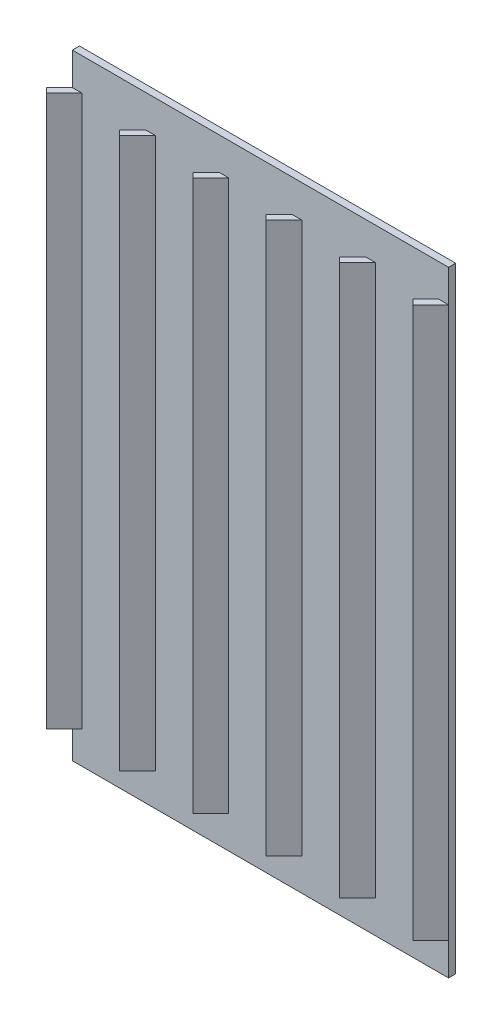
ISO-10303-21;
HEADER;
FILE_DESCRIPTION(('STEP AP214'),'2;1');
FILE_NAME('part.step','',(''),(''),'','','');
FILE_SCHEMA(('AUTOMOTIVE_DESIGN { 1 0 10303 214 1 1 1 1 }'));
ENDSEC;
DATA;
#1=APPLICATION_CONTEXT('core data for automotive mechanical design processes');
#2=APPLICATION_PROTOCOL_DEFINITION('international standard','automotive_design',2000,#1);
#3=PRODUCT_CONTEXT('',#1,'mechanical');
#4=PRODUCT('Part','Part','',(#3));
#5=PRODUCT_RELATED_PRODUCT_CATEGORY('part','',(#4));
#6=PRODUCT_DEFINITION_FORMATION('','',#4);
#7=PRODUCT_DEFINITION_CONTEXT('part definition',#1,'design');
#8=PRODUCT_DEFINITION('design','',#6,#7);
#9=PRODUCT_DEFINITION_SHAPE('','',#8);
#10=(LENGTH_UNIT() NAMED_UNIT(*) SI_UNIT(.MILLI.,.METRE.));
#11=(NAMED_UNIT(*) PLANE_ANGLE_UNIT() SI_UNIT($,.RADIAN.));
#12=(NAMED_UNIT(*) SI_UNIT($,.STERADIAN.) SOLID_ANGLE_UNIT());
#13=UNCERTAINTY_MEASURE_WITH_UNIT(LENGTH_MEASURE(1.E-05),#10,'distance_accuracy_value','');
#14=(GEOMETRIC_REPRESENTATION_CONTEXT(3) GLOBAL_UNCERTAINTY_ASSIGNED_CONTEXT((#13)) GLOBAL_UNIT_ASSIGNED_CONTEXT((#10,
#11,#12)) REPRESENTATION_CONTEXT('',''));
#15=CARTESIAN_POINT('',(0.,0.,0.));
#16=DIRECTION('',(0.,0.,1.));
#17=DIRECTION('',(1.,0.,0.));
#18=AXIS2_PLACEMENT_3D('',#15,#16,#17);
#19=CARTESIAN_POINT('',(-0.600993596973246,-25.4,0.9525));
#20=DIRECTION('',(0.,-1.,0.));
#21=DIRECTION('',(1.,0.,0.));
#22=AXIS2_PLACEMENT_3D('',#19,#20,#21);
#23=PLANE('',#22);
#24=DIRECTION('',(-1.,0.,0.));
#25=VECTOR('',#24,1.);
#26=CARTESIAN_POINT('',(-15.6680023283733,-25.4,0.254));
#27=LINE('',#26,#25);
#28=CARTESIAN_POINT('',(19.05,-25.4,0.254000000000018));
#29=VERTEX_POINT('',#28);
#30=CARTESIAN_POINT('',(18.1519743878931,-25.4,0.254000000000006));
#31=VERTEX_POINT('',#30);
#32=EDGE_CURVE('E58',#29,#31,#27,.T.);
#33=ORIENTED_EDGE('',*,*,#32,.F.);
#34=DIRECTION('',(0.707106781186548,0.,-0.707106781186548));
#35=VECTOR('',#34,1.);
#36=CARTESIAN_POINT('',(18.2245,-25.4,1.07950000000001));
#37=LINE('',#36,#35);
#38=CARTESIAN_POINT('',(17.399,-25.4,1.905));
#39=VERTEX_POINT('',#38);
#40=EDGE_CURVE('E366',#39,#29,#37,.T.);
#41=ORIENTED_EDGE('',*,*,#40,.F.);
#42=DIRECTION('',(-0.707106781186547,0.,-0.707106781186548));
#43=VECTOR('',#42,1.);
#44=CARTESIAN_POINT('',(17.1744935969733,-25.4,1.68049359697327));
#45=LINE('',#44,#43);
#46=CARTESIAN_POINT('',(16.9499871939465,-25.4,1.45598719394653));
#47=VERTEX_POINT('',#46);
#48=EDGE_CURVE('E358',#39,#47,#45,.T.);
#49=ORIENTED_EDGE('',*,*,#48,.T.);
#50=DIRECTION('',(0.707106781186548,0.,-0.707106781186548));
#51=VECTOR('',#50,1.);
#52=CARTESIAN_POINT('',(17.5509807909198,-25.4,0.854993596973271));
#53=LINE('',#52,#51);
#54=EDGE_CURVE('E349',#47,#31,#53,.T.);
#55=ORIENTED_EDGE('',*,*,#54,.T.);
#56=EDGE_LOOP('',(#33,#41,#49,#55));
#57=FACE_BOUND('',#56,.T.);
#58=ADVANCED_FACE('F47',(#57),#23,.T.);
#59=CARTESIAN_POINT('',(12.2860046567467,-25.4,0.254000000000004));
#60=VERTEX_POINT('',#59);
#61=CARTESIAN_POINT('',(11.3879790446398,-25.4,0.254000000000006));
#62=VERTEX_POINT('',#61);
#63=EDGE_CURVE('E11',#60,#62,#27,.T.);
#64=ORIENTED_EDGE('',*,*,#63,.F.);
#65=DIRECTION('',(0.707106781186548,0.,-0.707106781186548));
#66=VECTOR('',#65,1.);
#67=CARTESIAN_POINT('',(11.4605046567467,-25.4,1.0795));
#68=LINE('',#67,#66);
#69=CARTESIAN_POINT('',(10.6350046567467,-25.4,1.905));
#70=VERTEX_POINT('',#69);
#71=EDGE_CURVE('E338',#70,#60,#68,.T.);
#72=ORIENTED_EDGE('',*,*,#71,.F.);
#73=DIRECTION('',(-0.707106781186547,0.,-0.707106781186548));
#74=VECTOR('',#73,1.);
#75=CARTESIAN_POINT('',(10.41049825372,-25.4,1.68049359697327));
#76=LINE('',#75,#74);
#77=CARTESIAN_POINT('',(10.1859918506933,-25.4,1.45598719394653));
#78=VERTEX_POINT('',#77);
#79=EDGE_CURVE('E330',#70,#78,#76,.T.);
#80=ORIENTED_EDGE('',*,*,#79,.T.);
#81=DIRECTION('',(0.707106781186548,0.,-0.707106781186547));
#82=VECTOR('',#81,1.);
#83=CARTESIAN_POINT('',(10.7869854476665,-25.4,0.854993596973269));
#84=LINE('',#83,#82);
#85=EDGE_CURVE('E321',#78,#62,#84,.T.);
#86=ORIENTED_EDGE('',*,*,#85,.T.);
#87=EDGE_LOOP('',(#64,#72,#80,#86));
#88=FACE_BOUND('',#87,.T.);
#89=ADVANCED_FACE('F505',(#88),#23,.T.);
#90=CARTESIAN_POINT('',(5.52200931349343,-25.4,0.254));
#91=VERTEX_POINT('',#90);
#92=CARTESIAN_POINT('',(4.62398370138651,-25.4,0.254000000000007));
#93=VERTEX_POINT('',#92);
#94=EDGE_CURVE('E56',#91,#93,#27,.T.);
#95=ORIENTED_EDGE('',*,*,#94,.F.);
#96=DIRECTION('',(0.707106781186548,0.,-0.707106781186548));
#97=VECTOR('',#96,1.);
#98=CARTESIAN_POINT('',(4.69650931349343,-25.4,1.0795));
#99=LINE('',#98,#97);
#100=CARTESIAN_POINT('',(3.87100931349344,-25.4,1.905));
#101=VERTEX_POINT('',#100);
#102=EDGE_CURVE('E310',#101,#91,#99,.T.);
#103=ORIENTED_EDGE('',*,*,#102,.F.);
#104=DIRECTION('',(-0.707106781186547,0.,-0.707106781186548));
#105=VECTOR('',#104,1.);
#106=CARTESIAN_POINT('',(3.64650291046673,-25.4,1.68049359697327));
#107=LINE('',#106,#105);
#108=CARTESIAN_POINT('',(3.42199650743999,-25.4,1.45598719394653));
#109=VERTEX_POINT('',#108);
#110=EDGE_CURVE('E302',#101,#109,#107,.T.);
#111=ORIENTED_EDGE('',*,*,#110,.T.);
#112=DIRECTION('',(0.707106781186548,0.,-0.707106781186547));
#113=VECTOR('',#112,1.);
#114=CARTESIAN_POINT('',(4.02299010441325,-25.4,0.854993596973269));
#115=LINE('',#114,#113);
#116=EDGE_CURVE('E293',#109,#93,#115,.T.);
#117=ORIENTED_EDGE('',*,*,#116,.T.);
#118=EDGE_LOOP('',(#95,#103,#111,#117));
#119=FACE_BOUND('',#118,.T.);
#120=ADVANCED_FACE('F479',(#119),#23,.T.);
#121=CARTESIAN_POINT('',(-1.24198602975986,-25.4,0.254));
#122=VERTEX_POINT('',#121);
#123=CARTESIAN_POINT('',(-2.14001164186677,-25.4,0.254));
#124=VERTEX_POINT('',#123);
#125=EDGE_CURVE('E72',#122,#124,#27,.T.);
#126=ORIENTED_EDGE('',*,*,#125,.F.);
#127=DIRECTION('',(0.707106781186548,0.,-0.707106781186547));
#128=VECTOR('',#127,1.);
#129=CARTESIAN_POINT('',(-2.06748602975986,-25.4,1.0795));
#130=LINE('',#129,#128);
#131=CARTESIAN_POINT('',(-2.89298602975984,-25.4,1.905));
#132=VERTEX_POINT('',#131);
#133=EDGE_CURVE('E447',#132,#122,#130,.T.);
#134=ORIENTED_EDGE('',*,*,#133,.F.);
#135=DIRECTION('',(-0.707106781186547,0.,-0.707106781186548));
#136=VECTOR('',#135,1.);
#137=CARTESIAN_POINT('',(-3.11749243278657,-25.4,1.68049359697328));
#138=LINE('',#137,#136);
#139=CARTESIAN_POINT('',(-3.3419988358133,-25.4,1.45598719394654));
#140=VERTEX_POINT('',#139);
#141=EDGE_CURVE('E439',#132,#140,#138,.T.);
#142=ORIENTED_EDGE('',*,*,#141,.T.);
#143=DIRECTION('',(0.707106781186548,0.,-0.707106781186547));
#144=VECTOR('',#143,1.);
#145=CARTESIAN_POINT('',(-2.74100523884004,-25.4,0.854993596973269));
#146=LINE('',#145,#144);
#147=EDGE_CURVE('E431',#140,#124,#146,.T.);
#148=ORIENTED_EDGE('',*,*,#147,.T.);
#149=EDGE_LOOP('',(#126,#134,#142,#148));
#150=FACE_BOUND('',#149,.T.);
#151=ADVANCED_FACE('F526',(#150),#23,.T.);
#152=CARTESIAN_POINT('',(-8.00598137301315,-25.4,0.254000000000008));
#153=VERTEX_POINT('',#152);
#154=CARTESIAN_POINT('',(-8.90400698512006,-25.4,0.254));
#155=VERTEX_POINT('',#154);
#156=EDGE_CURVE('E472',#153,#155,#27,.T.);
#157=ORIENTED_EDGE('',*,*,#156,.F.);
#158=DIRECTION('',(0.707106781186547,0.,-0.707106781186548));
#159=VECTOR('',#158,1.);
#160=CARTESIAN_POINT('',(-8.83148137301314,-25.4,1.0795));
#161=LINE('',#160,#159);
#162=CARTESIAN_POINT('',(-9.65698137301311,-25.4,1.905));
#163=VERTEX_POINT('',#162);
#164=EDGE_CURVE('E420',#163,#153,#161,.T.);
#165=ORIENTED_EDGE('',*,*,#164,.F.);
#166=DIRECTION('',(-0.707106781186547,0.,-0.707106781186548));
#167=VECTOR('',#166,1.);
#168=CARTESIAN_POINT('',(-9.88148777603984,-25.4,1.68049359697327));
#169=LINE('',#168,#167);
#170=CARTESIAN_POINT('',(-10.1059941790666,-25.4,1.45598719394653));
#171=VERTEX_POINT('',#170);
#172=EDGE_CURVE('E412',#163,#171,#169,.T.);
#173=ORIENTED_EDGE('',*,*,#172,.T.);
#174=DIRECTION('',(0.707106781186548,0.,-0.707106781186547));
#175=VECTOR('',#174,1.);
#176=CARTESIAN_POINT('',(-9.50500058209333,-25.4,0.854993596973268));
#177=LINE('',#176,#175);
#178=EDGE_CURVE('E403',#171,#155,#177,.T.);
#179=ORIENTED_EDGE('',*,*,#178,.T.);
#180=EDGE_LOOP('',(#157,#165,#173,#179));
#181=FACE_BOUND('',#180,.T.);
#182=ADVANCED_FACE('F518',(#181),#23,.T.);
#183=CARTESIAN_POINT('',(-0.600993596973246,25.4,0.9525));
#184=DIRECTION('',(0.,-1.,0.));
#185=DIRECTION('',(1.,0.,0.));
#186=AXIS2_PLACEMENT_3D('',#183,#184,#185);
#187=PLANE('',#186);
#188=DIRECTION('',(1.,0.,0.));
#189=VECTOR('',#188,1.);
#190=CARTESIAN_POINT('',(-15.6680023283733,25.4,0.254000000000018));
#191=LINE('',#190,#189);
#192=CARTESIAN_POINT('',(-15.6680023283733,25.4,0.254));
#193=VERTEX_POINT('',#192);
#194=CARTESIAN_POINT('',(-14.7699767162664,25.4,0.254000000000007));
#195=VERTEX_POINT('',#194);
#196=EDGE_CURVE('E274',#193,#195,#191,.T.);
#197=ORIENTED_EDGE('',*,*,#196,.F.);
#198=DIRECTION('',(0.707106781186548,0.,-0.707106781186547));
#199=VECTOR('',#198,1.);
#200=CARTESIAN_POINT('',(-16.2689959253466,25.4,0.854993596973267));
#201=LINE('',#200,#199);
#202=CARTESIAN_POINT('',(-16.8699895223198,25.4,1.45598719394653));
#203=VERTEX_POINT('',#202);
#204=EDGE_CURVE('E381',#203,#193,#201,.T.);
#205=ORIENTED_EDGE('',*,*,#204,.F.);
#206=DIRECTION('',(-0.707106781186547,0.,-0.707106781186548));
#207=VECTOR('',#206,1.);
#208=CARTESIAN_POINT('',(-16.6454831192932,25.4,1.68049359697327));
#209=LINE('',#208,#207);
#210=CARTESIAN_POINT('',(-16.4209767162664,25.4,1.905));
#211=VERTEX_POINT('',#210);
#212=EDGE_CURVE('E390',#211,#203,#209,.T.);
#213=ORIENTED_EDGE('',*,*,#212,.F.);
#214=DIRECTION('',(0.707106781186547,0.,-0.707106781186548));
#215=VECTOR('',#214,1.);
#216=CARTESIAN_POINT('',(-15.5954767162665,25.4,1.0795));
#217=LINE('',#216,#215);
#218=EDGE_CURVE('E398',#211,#195,#217,.T.);
#219=ORIENTED_EDGE('',*,*,#218,.T.);
#220=EDGE_LOOP('',(#197,#205,#213,#219));
#221=FACE_BOUND('',#220,.T.);
#222=ADVANCED_FACE('F525',(#221),#187,.F.);
#223=CARTESIAN_POINT('',(-8.90400698512006,25.4,0.254));
#224=VERTEX_POINT('',#223);
#225=CARTESIAN_POINT('',(-8.00598137301315,25.4,0.254000000000008));
#226=VERTEX_POINT('',#225);
#227=EDGE_CURVE('E286',#224,#226,#191,.T.);
#228=ORIENTED_EDGE('',*,*,#227,.F.);
#229=DIRECTION('',(0.707106781186548,0.,-0.707106781186547));
#230=VECTOR('',#229,1.);
#231=CARTESIAN_POINT('',(-9.50500058209333,25.4,0.854993596973268));
#232=LINE('',#231,#230);
#233=CARTESIAN_POINT('',(-10.1059941790666,25.4,1.45598719394653));
#234=VERTEX_POINT('',#233);
#235=EDGE_CURVE('E409',#234,#224,#232,.T.);
#236=ORIENTED_EDGE('',*,*,#235,.F.);
#237=DIRECTION('',(-0.707106781186547,0.,-0.707106781186548));
#238=VECTOR('',#237,1.);
#239=CARTESIAN_POINT('',(-9.88148777603984,25.4,1.68049359697327));
#240=LINE('',#239,#238);
#241=CARTESIAN_POINT('',(-9.65698137301311,25.4,1.905));
#242=VERTEX_POINT('',#241);
#243=EDGE_CURVE('E418',#242,#234,#240,.T.);
#244=ORIENTED_EDGE('',*,*,#243,.F.);
#245=DIRECTION('',(0.707106781186547,0.,-0.707106781186548));
#246=VECTOR('',#245,1.);
#247=CARTESIAN_POINT('',(-8.83148137301314,25.4,1.0795));
#248=LINE('',#247,#246);
#249=EDGE_CURVE('E426',#242,#226,#248,.T.);
#250=ORIENTED_EDGE('',*,*,#249,.T.);
#251=EDGE_LOOP('',(#228,#236,#244,#250));
#252=FACE_BOUND('',#251,.T.);
#253=ADVANCED_FACE('F533',(#252),#187,.F.);
#254=CARTESIAN_POINT('',(-2.14001164186677,25.4,0.254));
#255=VERTEX_POINT('',#254);
#256=CARTESIAN_POINT('',(-1.24198602975986,25.4,0.254));
#257=VERTEX_POINT('',#256);
#258=EDGE_CURVE('E464',#255,#257,#191,.T.);
#259=ORIENTED_EDGE('',*,*,#258,.F.);
#260=DIRECTION('',(0.707106781186548,0.,-0.707106781186547));
#261=VECTOR('',#260,1.);
#262=CARTESIAN_POINT('',(-2.74100523884004,25.4,0.854993596973269));
#263=LINE('',#262,#261);
#264=CARTESIAN_POINT('',(-3.3419988358133,25.4,1.45598719394654));
#265=VERTEX_POINT('',#264);
#266=EDGE_CURVE('E436',#265,#255,#263,.T.);
#267=ORIENTED_EDGE('',*,*,#266,.F.);
#268=DIRECTION('',(-0.707106781186547,0.,-0.707106781186548));
#269=VECTOR('',#268,1.);
#270=CARTESIAN_POINT('',(-3.11749243278657,25.4,1.68049359697328));
#271=LINE('',#270,#269);
#272=CARTESIAN_POINT('',(-2.89298602975984,25.4,1.905));
#273=VERTEX_POINT('',#272);
#274=EDGE_CURVE('E445',#273,#265,#271,.T.);
#275=ORIENTED_EDGE('',*,*,#274,.F.);
#276=DIRECTION('',(0.707106781186548,0.,-0.707106781186547));
#277=VECTOR('',#276,1.);
#278=CARTESIAN_POINT('',(-2.06748602975986,25.4,1.0795));
#279=LINE('',#278,#277);
#280=EDGE_CURVE('E451',#273,#257,#279,.T.);
#281=ORIENTED_EDGE('',*,*,#280,.T.);
#282=EDGE_LOOP('',(#259,#267,#275,#281));
#283=FACE_BOUND('',#282,.T.);
#284=ADVANCED_FACE('F549',(#283),#187,.F.);
#285=CARTESIAN_POINT('',(4.62398370138651,25.4,0.254000000000007));
#286=VERTEX_POINT('',#285);
#287=CARTESIAN_POINT('',(5.52200931349343,25.4,0.254));
#288=VERTEX_POINT('',#287);
#289=EDGE_CURVE('E460',#286,#288,#191,.T.);
#290=ORIENTED_EDGE('',*,*,#289,.F.);
#291=DIRECTION('',(0.707106781186548,0.,-0.707106781186547));
#292=VECTOR('',#291,1.);
#293=CARTESIAN_POINT('',(4.02299010441325,25.4,0.854993596973269));
#294=LINE('',#293,#292);
#295=CARTESIAN_POINT('',(3.42199650743999,25.4,1.45598719394653));
#296=VERTEX_POINT('',#295);
#297=EDGE_CURVE('E299',#296,#286,#294,.T.);
#298=ORIENTED_EDGE('',*,*,#297,.F.);
#299=DIRECTION('',(-0.707106781186547,0.,-0.707106781186548));
#300=VECTOR('',#299,1.);
#301=CARTESIAN_POINT('',(3.64650291046673,25.4,1.68049359697327));
#302=LINE('',#301,#300);
#303=CARTESIAN_POINT('',(3.87100931349344,25.4,1.905));
#304=VERTEX_POINT('',#303);
#305=EDGE_CURVE('E308',#304,#296,#302,.T.);
#306=ORIENTED_EDGE('',*,*,#305,.F.);
#307=DIRECTION('',(0.707106781186548,0.,-0.707106781186548));
#308=VECTOR('',#307,1.);
#309=CARTESIAN_POINT('',(4.69650931349343,25.4,1.0795));
#310=LINE('',#309,#308);
#311=EDGE_CURVE('E316',#304,#288,#310,.T.);
#312=ORIENTED_EDGE('',*,*,#311,.T.);
#313=EDGE_LOOP('',(#290,#298,#306,#312));
#314=FACE_BOUND('',#313,.T.);
#315=ADVANCED_FACE('F487',(#314),#187,.F.);
#316=CARTESIAN_POINT('',(11.3879790446398,25.4,0.254000000000006));
#317=VERTEX_POINT('',#316);
#318=CARTESIAN_POINT('',(12.2860046567467,25.4,0.254000000000004));
#319=VERTEX_POINT('',#318);
#320=EDGE_CURVE('E456',#317,#319,#191,.T.);
#321=ORIENTED_EDGE('',*,*,#320,.F.);
#322=DIRECTION('',(0.707106781186548,0.,-0.707106781186547));
#323=VECTOR('',#322,1.);
#324=CARTESIAN_POINT('',(10.7869854476665,25.4,0.854993596973269));
#325=LINE('',#324,#323);
#326=CARTESIAN_POINT('',(10.1859918506933,25.4,1.45598719394653));
#327=VERTEX_POINT('',#326);
#328=EDGE_CURVE('E327',#327,#317,#325,.T.);
#329=ORIENTED_EDGE('',*,*,#328,.F.);
#330=DIRECTION('',(-0.707106781186547,0.,-0.707106781186548));
#331=VECTOR('',#330,1.);
#332=CARTESIAN_POINT('',(10.41049825372,25.4,1.68049359697327));
#333=LINE('',#332,#331);
#334=CARTESIAN_POINT('',(10.6350046567467,25.4,1.905));
#335=VERTEX_POINT('',#334);
#336=EDGE_CURVE('E336',#335,#327,#333,.T.);
#337=ORIENTED_EDGE('',*,*,#336,.F.);
#338=DIRECTION('',(0.707106781186548,0.,-0.707106781186548));
#339=VECTOR('',#338,1.);
#340=CARTESIAN_POINT('',(11.4605046567467,25.4,1.0795));
#341=LINE('',#340,#339);
#342=EDGE_CURVE('E344',#335,#319,#341,.T.);
#343=ORIENTED_EDGE('',*,*,#342,.T.);
#344=EDGE_LOOP('',(#321,#329,#337,#343));
#345=FACE_BOUND('',#344,.T.);
#346=ADVANCED_FACE('F665',(#345),#187,.F.);
#347=CARTESIAN_POINT('',(18.1519743878931,25.4,0.254000000000006));
#348=VERTEX_POINT('',#347);
#349=CARTESIAN_POINT('',(19.05,25.4,0.254000000000018));
#350=VERTEX_POINT('',#349);
#351=EDGE_CURVE('E287',#348,#350,#191,.T.);
#352=ORIENTED_EDGE('',*,*,#351,.F.);
#353=DIRECTION('',(0.707106781186548,0.,-0.707106781186548));
#354=VECTOR('',#353,1.);
#355=CARTESIAN_POINT('',(17.5509807909198,25.4,0.854993596973271));
#356=LINE('',#355,#354);
#357=CARTESIAN_POINT('',(16.9499871939465,25.4,1.45598719394653));
#358=VERTEX_POINT('',#357);
#359=EDGE_CURVE('E355',#358,#348,#356,.T.);
#360=ORIENTED_EDGE('',*,*,#359,.F.);
#361=DIRECTION('',(-0.707106781186547,0.,-0.707106781186548));
#362=VECTOR('',#361,1.);
#363=CARTESIAN_POINT('',(17.1744935969733,25.4,1.68049359697327));
#364=LINE('',#363,#362);
#365=CARTESIAN_POINT('',(17.399,25.4,1.905));
#366=VERTEX_POINT('',#365);
#367=EDGE_CURVE('E364',#366,#358,#364,.T.);
#368=ORIENTED_EDGE('',*,*,#367,.F.);
#369=DIRECTION('',(0.707106781186548,0.,-0.707106781186548));
#370=VECTOR('',#369,1.);
#371=CARTESIAN_POINT('',(18.2245,25.4,1.07950000000001));
#372=LINE('',#371,#370);
#373=EDGE_CURVE('E372',#366,#350,#372,.T.);
#374=ORIENTED_EDGE('',*,*,#373,.T.);
#375=EDGE_LOOP('',(#352,#360,#368,#374));
#376=FACE_BOUND('',#375,.T.);
#377=ADVANCED_FACE('F535',(#376),#187,.F.);
#378=CARTESIAN_POINT('',(-2.06748602975986,-25.4,1.0795));
#379=DIRECTION('',(0.707106781186547,0.,0.707106781186548));
#380=DIRECTION('',(0.707106781186548,0.,-0.707106781186547));
#381=AXIS2_PLACEMENT_3D('',#378,#379,#380);
#382=PLANE('',#381);
#383=ORIENTED_EDGE('',*,*,#280,.F.);
#384=DIRECTION('',(0.,1.,0.));
#385=VECTOR('',#384,1.);
#386=CARTESIAN_POINT('',(-2.89298602975984,-25.4,1.905));
#387=LINE('',#386,#385);
#388=EDGE_CURVE('E449',#132,#273,#387,.T.);
#389=ORIENTED_EDGE('',*,*,#388,.F.);
#390=ORIENTED_EDGE('',*,*,#133,.T.);
#391=DIRECTION('',(0.,1.,0.));
#392=VECTOR('',#391,1.);
#393=CARTESIAN_POINT('',(-1.24198602975986,-25.4,0.254));
#394=LINE('',#393,#392);
#395=EDGE_CURVE('E51',#122,#257,#394,.T.);
#396=ORIENTED_EDGE('',*,*,#395,.T.);
#397=EDGE_LOOP('',(#383,#389,#390,#396));
#398=FACE_BOUND('',#397,.T.);
#399=ADVANCED_FACE('F49',(#398),#382,.T.);
#400=CARTESIAN_POINT('',(-3.11749243278657,-25.4,1.68049359697328));
#401=DIRECTION('',(0.707106781186548,0.,-0.707106781186547));
#402=DIRECTION('',(-0.707106781186547,0.,-0.707106781186548));
#403=AXIS2_PLACEMENT_3D('',#400,#401,#402);
#404=PLANE('',#403);
#405=ORIENTED_EDGE('',*,*,#274,.T.);
#406=DIRECTION('',(0.,1.,0.));
#407=VECTOR('',#406,1.);
#408=CARTESIAN_POINT('',(-3.3419988358133,-25.4,1.45598719394654));
#409=LINE('',#408,#407);
#410=EDGE_CURVE('E442',#140,#265,#409,.T.);
#411=ORIENTED_EDGE('',*,*,#410,.F.);
#412=ORIENTED_EDGE('',*,*,#141,.F.);
#413=ORIENTED_EDGE('',*,*,#388,.T.);
#414=EDGE_LOOP('',(#405,#411,#412,#413));
#415=FACE_BOUND('',#414,.T.);
#416=ADVANCED_FACE('F795',(#415),#404,.F.);
#417=CARTESIAN_POINT('',(-2.74100523884004,-25.4,0.854993596973269));
#418=DIRECTION('',(0.707106781186547,0.,0.707106781186548));
#419=DIRECTION('',(0.707106781186548,0.,-0.707106781186547));
#420=AXIS2_PLACEMENT_3D('',#417,#418,#419);
#421=PLANE('',#420);
#422=ORIENTED_EDGE('',*,*,#266,.T.);
#423=DIRECTION('',(0.,1.,0.));
#424=VECTOR('',#423,1.);
#425=CARTESIAN_POINT('',(-2.14001164186677,-25.4,0.254));
#426=LINE('',#425,#424);
#427=EDGE_CURVE('E433',#124,#255,#426,.T.);
#428=ORIENTED_EDGE('',*,*,#427,.F.);
#429=ORIENTED_EDGE('',*,*,#147,.F.);
#430=ORIENTED_EDGE('',*,*,#410,.T.);
#431=EDGE_LOOP('',(#422,#428,#429,#430));
#432=FACE_BOUND('',#431,.T.);
#433=ADVANCED_FACE('F793',(#432),#421,.F.);
#434=CARTESIAN_POINT('',(-8.83148137301314,-25.4,1.0795));
#435=DIRECTION('',(0.707106781186548,0.,0.707106781186547));
#436=DIRECTION('',(0.707106781186547,0.,-0.707106781186548));
#437=AXIS2_PLACEMENT_3D('',#434,#435,#436);
#438=PLANE('',#437);
#439=ORIENTED_EDGE('',*,*,#249,.F.);
#440=DIRECTION('',(0.,1.,0.));
#441=VECTOR('',#440,1.);
#442=CARTESIAN_POINT('',(-9.65698137301311,-25.4,1.905));
#443=LINE('',#442,#441);
#444=EDGE_CURVE('E423',#163,#242,#443,.T.);
#445=ORIENTED_EDGE('',*,*,#444,.F.);
#446=ORIENTED_EDGE('',*,*,#164,.T.);
#447=DIRECTION('',(0.,1.,0.));
#448=VECTOR('',#447,1.);
#449=CARTESIAN_POINT('',(-8.00598137301315,-25.4,0.254000000000008));
#450=LINE('',#449,#448);
#451=EDGE_CURVE('E429',#153,#226,#450,.T.);
#452=ORIENTED_EDGE('',*,*,#451,.T.);
#453=EDGE_LOOP('',(#439,#445,#446,#452));
#454=FACE_BOUND('',#453,.T.);
#455=ADVANCED_FACE('F539',(#454),#438,.T.);
#456=CARTESIAN_POINT('',(-9.88148777603984,-25.4,1.68049359697327));
#457=DIRECTION('',(0.707106781186548,0.,-0.707106781186547));
#458=DIRECTION('',(-0.707106781186547,0.,-0.707106781186548));
#459=AXIS2_PLACEMENT_3D('',#456,#457,#458);
#460=PLANE('',#459);
#461=ORIENTED_EDGE('',*,*,#243,.T.);
#462=DIRECTION('',(0.,1.,0.));
#463=VECTOR('',#462,1.);
#464=CARTESIAN_POINT('',(-10.1059941790666,-25.4,1.45598719394653));
#465=LINE('',#464,#463);
#466=EDGE_CURVE('E415',#171,#234,#465,.T.);
#467=ORIENTED_EDGE('',*,*,#466,.F.);
#468=ORIENTED_EDGE('',*,*,#172,.F.);
#469=ORIENTED_EDGE('',*,*,#444,.T.);
#470=EDGE_LOOP('',(#461,#467,#468,#469));
#471=FACE_BOUND('',#470,.T.);
#472=ADVANCED_FACE('F543',(#471),#460,.F.);
#473=CARTESIAN_POINT('',(-9.50500058209333,-25.4,0.854993596973268));
#474=DIRECTION('',(0.707106781186547,0.,0.707106781186548));
#475=DIRECTION('',(0.707106781186548,0.,-0.707106781186547));
#476=AXIS2_PLACEMENT_3D('',#473,#474,#475);
#477=PLANE('',#476);
#478=ORIENTED_EDGE('',*,*,#235,.T.);
#479=DIRECTION('',(0.,1.,0.));
#480=VECTOR('',#479,1.);
#481=CARTESIAN_POINT('',(-8.90400698512006,-25.4,0.254));
#482=LINE('',#481,#480);
#483=EDGE_CURVE('E406',#155,#224,#482,.T.);
#484=ORIENTED_EDGE('',*,*,#483,.F.);
#485=ORIENTED_EDGE('',*,*,#178,.F.);
#486=ORIENTED_EDGE('',*,*,#466,.T.);
#487=EDGE_LOOP('',(#478,#484,#485,#486));
#488=FACE_BOUND('',#487,.T.);
#489=ADVANCED_FACE('F546',(#488),#477,.F.);
#490=CARTESIAN_POINT('',(-15.5954767162665,-25.4,1.0795));
#491=DIRECTION('',(0.707106781186548,0.,0.707106781186547));
#492=DIRECTION('',(0.707106781186547,0.,-0.707106781186548));
#493=AXIS2_PLACEMENT_3D('',#490,#491,#492);
#494=PLANE('',#493);
#495=ORIENTED_EDGE('',*,*,#218,.F.);
#496=DIRECTION('',(0.,1.,0.));
#497=VECTOR('',#496,1.);
#498=CARTESIAN_POINT('',(-16.4209767162664,-25.4,1.905));
#499=LINE('',#498,#497);
#500=CARTESIAN_POINT('',(-16.4209767162664,-25.4,1.905));
#501=VERTEX_POINT('',#500);
#502=EDGE_CURVE('E395',#501,#211,#499,.T.);
#503=ORIENTED_EDGE('',*,*,#502,.F.);
#504=DIRECTION('',(0.707106781186547,0.,-0.707106781186548));
#505=VECTOR('',#504,1.);
#506=CARTESIAN_POINT('',(-15.5954767162665,-25.4,1.0795));
#507=LINE('',#506,#505);
#508=CARTESIAN_POINT('',(-14.7699767162664,-25.4,0.254000000000007));
#509=VERTEX_POINT('',#508);
#510=EDGE_CURVE('E392',#501,#509,#507,.T.);
#511=ORIENTED_EDGE('',*,*,#510,.T.);
#512=DIRECTION('',(0.,1.,0.));
#513=VECTOR('',#512,1.);
#514=CARTESIAN_POINT('',(-14.7699767162664,-25.4,0.254000000000007));
#515=LINE('',#514,#513);
#516=EDGE_CURVE('E401',#509,#195,#515,.T.);
#517=ORIENTED_EDGE('',*,*,#516,.T.);
#518=EDGE_LOOP('',(#495,#503,#511,#517));
#519=FACE_BOUND('',#518,.T.);
#520=ADVANCED_FACE('F783',(#519),#494,.T.);
#521=CARTESIAN_POINT('',(-16.6454831192932,-25.4,1.68049359697327));
#522=DIRECTION('',(0.707106781186548,0.,-0.707106781186547));
#523=DIRECTION('',(-0.707106781186547,0.,-0.707106781186548));
#524=AXIS2_PLACEMENT_3D('',#521,#522,#523);
#525=PLANE('',#524);
#526=ORIENTED_EDGE('',*,*,#212,.T.);
#527=DIRECTION('',(0.,1.,0.));
#528=VECTOR('',#527,1.);
#529=CARTESIAN_POINT('',(-16.8699895223198,-25.4,1.45598719394653));
#530=LINE('',#529,#528);
#531=CARTESIAN_POINT('',(-16.8699895223198,-25.4,1.45598719394653));
#532=VERTEX_POINT('',#531);
#533=EDGE_CURVE('E387',#532,#203,#530,.T.);
#534=ORIENTED_EDGE('',*,*,#533,.F.);
#535=DIRECTION('',(-0.707106781186547,0.,-0.707106781186548));
#536=VECTOR('',#535,1.);
#537=CARTESIAN_POINT('',(-16.6454831192932,-25.4,1.68049359697327));
#538=LINE('',#537,#536);
#539=EDGE_CURVE('E384',#501,#532,#538,.T.);
#540=ORIENTED_EDGE('',*,*,#539,.F.);
#541=ORIENTED_EDGE('',*,*,#502,.T.);
#542=EDGE_LOOP('',(#526,#534,#540,#541));
#543=FACE_BOUND('',#542,.T.);
#544=ADVANCED_FACE('F780',(#543),#525,.F.);
#545=CARTESIAN_POINT('',(-16.2689959253466,-25.4,0.854993596973267));
#546=DIRECTION('',(0.707106781186547,0.,0.707106781186548));
#547=DIRECTION('',(0.707106781186548,0.,-0.707106781186547));
#548=AXIS2_PLACEMENT_3D('',#545,#546,#547);
#549=PLANE('',#548);
#550=ORIENTED_EDGE('',*,*,#204,.T.);
#551=DIRECTION('',(0.,1.,0.));
#552=VECTOR('',#551,1.);
#553=CARTESIAN_POINT('',(-15.6680023283733,-25.4,0.254));
#554=LINE('',#553,#552);
#555=CARTESIAN_POINT('',(-15.6680023283733,-25.4,0.254));
#556=VERTEX_POINT('',#555);
#557=EDGE_CURVE('E379',#556,#193,#554,.T.);
#558=ORIENTED_EDGE('',*,*,#557,.F.);
#559=DIRECTION('',(0.707106781186548,0.,-0.707106781186547));
#560=VECTOR('',#559,1.);
#561=CARTESIAN_POINT('',(-16.2689959253466,-25.4,0.854993596973267));
#562=LINE('',#561,#560);
#563=EDGE_CURVE('E377',#532,#556,#562,.T.);
#564=ORIENTED_EDGE('',*,*,#563,.F.);
#565=ORIENTED_EDGE('',*,*,#533,.T.);
#566=EDGE_LOOP('',(#550,#558,#564,#565));
#567=FACE_BOUND('',#566,.T.);
#568=ADVANCED_FACE('F594',(#567),#549,.F.);
#569=CARTESIAN_POINT('',(19.05,-25.4,0.127));
#570=DIRECTION('',(1.,0.,0.));
#571=DIRECTION('',(0.,0.,-1.));
#572=AXIS2_PLACEMENT_3D('',#569,#570,#571);
#573=PLANE('',#572);
#574=DIRECTION('',(0.,1.,0.));
#575=VECTOR('',#574,1.);
#576=CARTESIAN_POINT('',(19.05,-63.5020996796765,-0.400000000000001));
#577=LINE('',#576,#575);
#578=CARTESIAN_POINT('',(19.05,-28.4,-0.400000000000001));
#579=VERTEX_POINT('',#578);
#580=CARTESIAN_POINT('',(19.05,28.4,-0.400000000000001));
#581=VERTEX_POINT('',#580);
#582=EDGE_CURVE('E249',#579,#581,#577,.T.);
#583=ORIENTED_EDGE('',*,*,#582,.T.);
#584=DIRECTION('',(0.,0.,-1.));
#585=VECTOR('',#584,1.);
#586=CARTESIAN_POINT('',(19.05,28.4,-0.400000000000001));
#587=LINE('',#586,#585);
#588=CARTESIAN_POINT('',(19.05,28.4,0.254000000000018));
#589=VERTEX_POINT('',#588);
#590=EDGE_CURVE('E278',#589,#581,#587,.T.);
#591=ORIENTED_EDGE('',*,*,#590,.F.);
#592=DIRECTION('',(0.,-1.,0.));
#593=VECTOR('',#592,1.);
#594=CARTESIAN_POINT('',(19.05,28.4,0.254000000000018));
#595=LINE('',#594,#593);
#596=EDGE_CURVE('E283',#589,#350,#595,.T.);
#597=ORIENTED_EDGE('',*,*,#596,.T.);
#598=DIRECTION('',(0.,1.,0.));
#599=VECTOR('',#598,1.);
#600=CARTESIAN_POINT('',(19.05,-25.4,0.254000000000018));
#601=LINE('',#600,#599);
#602=EDGE_CURVE('E374',#29,#350,#601,.T.);
#603=ORIENTED_EDGE('',*,*,#602,.F.);
#604=DIRECTION('',(0.,1.,0.));
#605=VECTOR('',#604,1.);
#606=CARTESIAN_POINT('',(19.05,-28.4,0.254));
#607=LINE('',#606,#605);
#608=CARTESIAN_POINT('',(19.05,-28.4,0.254));
#609=VERTEX_POINT('',#608);
#610=EDGE_CURVE('E271',#609,#29,#607,.T.);
#611=ORIENTED_EDGE('',*,*,#610,.F.);
#612=DIRECTION('',(0.,0.,1.));
#613=VECTOR('',#612,1.);
#614=CARTESIAN_POINT('',(19.05,-28.4,0.254));
#615=LINE('',#614,#613);
#616=EDGE_CURVE('E257',#579,#609,#615,.T.);
#617=ORIENTED_EDGE('',*,*,#616,.F.);
#618=EDGE_LOOP('',(#583,#591,#597,#603,#611,#617));
#619=FACE_BOUND('',#618,.T.);
#620=ADVANCED_FACE('F588',(#619),#573,.T.);
#621=CARTESIAN_POINT('',(18.2245,-25.4,1.07950000000001));
#622=DIRECTION('',(0.707106781186548,0.,0.707106781186548));
#623=DIRECTION('',(0.707106781186548,0.,-0.707106781186548));
#624=AXIS2_PLACEMENT_3D('',#621,#622,#623);
#625=PLANE('',#624);
#626=ORIENTED_EDGE('',*,*,#373,.F.);
#627=DIRECTION('',(0.,1.,0.));
#628=VECTOR('',#627,1.);
#629=CARTESIAN_POINT('',(17.399,-25.4,1.905));
#630=LINE('',#629,#628);
#631=EDGE_CURVE('E369',#39,#366,#630,.T.);
#632=ORIENTED_EDGE('',*,*,#631,.F.);
#633=ORIENTED_EDGE('',*,*,#40,.T.);
#634=ORIENTED_EDGE('',*,*,#602,.T.);
#635=EDGE_LOOP('',(#626,#632,#633,#634));
#636=FACE_BOUND('',#635,.T.);
#637=ADVANCED_FACE('F593',(#636),#625,.T.);
#638=CARTESIAN_POINT('',(17.1744935969733,-25.4,1.68049359697327));
#639=DIRECTION('',(0.707106781186548,0.,-0.707106781186547));
#640=DIRECTION('',(-0.707106781186547,0.,-0.707106781186548));
#641=AXIS2_PLACEMENT_3D('',#638,#639,#640);
#642=PLANE('',#641);
#643=ORIENTED_EDGE('',*,*,#367,.T.);
#644=DIRECTION('',(0.,1.,0.));
#645=VECTOR('',#644,1.);
#646=CARTESIAN_POINT('',(16.9499871939465,-25.4,1.45598719394653));
#647=LINE('',#646,#645);
#648=EDGE_CURVE('E361',#47,#358,#647,.T.);
#649=ORIENTED_EDGE('',*,*,#648,.F.);
#650=ORIENTED_EDGE('',*,*,#48,.F.);
#651=ORIENTED_EDGE('',*,*,#631,.T.);
#652=EDGE_LOOP('',(#643,#649,#650,#651));
#653=FACE_BOUND('',#652,.T.);
#654=ADVANCED_FACE('F728',(#653),#642,.F.);
#655=CARTESIAN_POINT('',(17.5509807909198,-25.4,0.854993596973271));
#656=DIRECTION('',(0.707106781186548,0.,0.707106781186548));
#657=DIRECTION('',(0.707106781186548,0.,-0.707106781186548));
#658=AXIS2_PLACEMENT_3D('',#655,#656,#657);
#659=PLANE('',#658);
#660=ORIENTED_EDGE('',*,*,#359,.T.);
#661=DIRECTION('',(0.,1.,0.));
#662=VECTOR('',#661,1.);
#663=CARTESIAN_POINT('',(18.1519743878931,-25.4,0.254000000000006));
#664=LINE('',#663,#662);
#665=EDGE_CURVE('E352',#31,#348,#664,.T.);
#666=ORIENTED_EDGE('',*,*,#665,.F.);
#667=ORIENTED_EDGE('',*,*,#54,.F.);
#668=ORIENTED_EDGE('',*,*,#648,.T.);
#669=EDGE_LOOP('',(#660,#666,#667,#668));
#670=FACE_BOUND('',#669,.T.);
#671=ADVANCED_FACE('F737',(#670),#659,.F.);
#672=CARTESIAN_POINT('',(11.4605046567467,-25.4,1.0795));
#673=DIRECTION('',(0.707106781186548,0.,0.707106781186548));
#674=DIRECTION('',(0.707106781186548,0.,-0.707106781186548));
#675=AXIS2_PLACEMENT_3D('',#672,#673,#674);
#676=PLANE('',#675);
#677=ORIENTED_EDGE('',*,*,#342,.F.);
#678=DIRECTION('',(0.,1.,0.));
#679=VECTOR('',#678,1.);
#680=CARTESIAN_POINT('',(10.6350046567467,-25.4,1.905));
#681=LINE('',#680,#679);
#682=EDGE_CURVE('E341',#70,#335,#681,.T.);
#683=ORIENTED_EDGE('',*,*,#682,.F.);
#684=ORIENTED_EDGE('',*,*,#71,.T.);
#685=DIRECTION('',(0.,1.,0.));
#686=VECTOR('',#685,1.);
#687=CARTESIAN_POINT('',(12.2860046567467,-25.4,0.254000000000004));
#688=LINE('',#687,#686);
#689=EDGE_CURVE('E347',#60,#319,#688,.T.);
#690=ORIENTED_EDGE('',*,*,#689,.T.);
#691=EDGE_LOOP('',(#677,#683,#684,#690));
#692=FACE_BOUND('',#691,.T.);
#693=ADVANCED_FACE('F746',(#692),#676,.T.);
#694=CARTESIAN_POINT('',(10.41049825372,-25.4,1.68049359697327));
#695=DIRECTION('',(0.707106781186548,0.,-0.707106781186547));
#696=DIRECTION('',(-0.707106781186547,0.,-0.707106781186548));
#697=AXIS2_PLACEMENT_3D('',#694,#695,#696);
#698=PLANE('',#697);
#699=ORIENTED_EDGE('',*,*,#336,.T.);
#700=DIRECTION('',(0.,1.,0.));
#701=VECTOR('',#700,1.);
#702=CARTESIAN_POINT('',(10.1859918506933,-25.4,1.45598719394653));
#703=LINE('',#702,#701);
#704=EDGE_CURVE('E333',#78,#327,#703,.T.);
#705=ORIENTED_EDGE('',*,*,#704,.F.);
#706=ORIENTED_EDGE('',*,*,#79,.F.);
#707=ORIENTED_EDGE('',*,*,#682,.T.);
#708=EDGE_LOOP('',(#699,#705,#706,#707));
#709=FACE_BOUND('',#708,.T.);
#710=ADVANCED_FACE('F754',(#709),#698,.F.);
#711=CARTESIAN_POINT('',(10.7869854476665,-25.4,0.854993596973269));
#712=DIRECTION('',(0.707106781186547,0.,0.707106781186548));
#713=DIRECTION('',(0.707106781186548,0.,-0.707106781186547));
#714=AXIS2_PLACEMENT_3D('',#711,#712,#713);
#715=PLANE('',#714);
#716=ORIENTED_EDGE('',*,*,#328,.T.);
#717=DIRECTION('',(0.,1.,0.));
#718=VECTOR('',#717,1.);
#719=CARTESIAN_POINT('',(11.3879790446398,-25.4,0.254000000000006));
#720=LINE('',#719,#718);
#721=EDGE_CURVE('E324',#62,#317,#720,.T.);
#722=ORIENTED_EDGE('',*,*,#721,.F.);
#723=ORIENTED_EDGE('',*,*,#85,.F.);
#724=ORIENTED_EDGE('',*,*,#704,.T.);
#725=EDGE_LOOP('',(#716,#722,#723,#724));
#726=FACE_BOUND('',#725,.T.);
#727=ADVANCED_FACE('F502',(#726),#715,.F.);
#728=CARTESIAN_POINT('',(4.69650931349343,-25.4,1.0795));
#729=DIRECTION('',(0.707106781186548,0.,0.707106781186548));
#730=DIRECTION('',(0.707106781186548,0.,-0.707106781186548));
#731=AXIS2_PLACEMENT_3D('',#728,#729,#730);
#732=PLANE('',#731);
#733=ORIENTED_EDGE('',*,*,#311,.F.);
#734=DIRECTION('',(0.,1.,0.));
#735=VECTOR('',#734,1.);
#736=CARTESIAN_POINT('',(3.87100931349344,-25.4,1.905));
#737=LINE('',#736,#735);
#738=EDGE_CURVE('E313',#101,#304,#737,.T.);
#739=ORIENTED_EDGE('',*,*,#738,.F.);
#740=ORIENTED_EDGE('',*,*,#102,.T.);
#741=DIRECTION('',(0.,1.,0.));
#742=VECTOR('',#741,1.);
#743=CARTESIAN_POINT('',(5.52200931349343,-25.4,0.254));
#744=LINE('',#743,#742);
#745=EDGE_CURVE('E319',#91,#288,#744,.T.);
#746=ORIENTED_EDGE('',*,*,#745,.T.);
#747=EDGE_LOOP('',(#733,#739,#740,#746));
#748=FACE_BOUND('',#747,.T.);
#749=ADVANCED_FACE('F489',(#748),#732,.T.);
#750=CARTESIAN_POINT('',(3.64650291046673,-25.4,1.68049359697327));
#751=DIRECTION('',(0.707106781186548,0.,-0.707106781186547));
#752=DIRECTION('',(-0.707106781186547,0.,-0.707106781186548));
#753=AXIS2_PLACEMENT_3D('',#750,#751,#752);
#754=PLANE('',#753);
#755=ORIENTED_EDGE('',*,*,#305,.T.);
#756=DIRECTION('',(0.,1.,0.));
#757=VECTOR('',#756,1.);
#758=CARTESIAN_POINT('',(3.42199650743999,-25.4,1.45598719394653));
#759=LINE('',#758,#757);
#760=EDGE_CURVE('E305',#109,#296,#759,.T.);
#761=ORIENTED_EDGE('',*,*,#760,.F.);
#762=ORIENTED_EDGE('',*,*,#110,.F.);
#763=ORIENTED_EDGE('',*,*,#738,.T.);
#764=EDGE_LOOP('',(#755,#761,#762,#763));
#765=FACE_BOUND('',#764,.T.);
#766=ADVANCED_FACE('F491',(#765),#754,.F.);
#767=CARTESIAN_POINT('',(4.02299010441325,-25.4,0.854993596973269));
#768=DIRECTION('',(0.707106781186547,0.,0.707106781186548));
#769=DIRECTION('',(0.707106781186548,0.,-0.707106781186547));
#770=AXIS2_PLACEMENT_3D('',#767,#768,#769);
#771=PLANE('',#770);
#772=ORIENTED_EDGE('',*,*,#297,.T.);
#773=DIRECTION('',(0.,1.,0.));
#774=VECTOR('',#773,1.);
#775=CARTESIAN_POINT('',(4.62398370138651,-25.4,0.254000000000007));
#776=LINE('',#775,#774);
#777=EDGE_CURVE('E296',#93,#286,#776,.T.);
#778=ORIENTED_EDGE('',*,*,#777,.F.);
#779=ORIENTED_EDGE('',*,*,#116,.F.);
#780=ORIENTED_EDGE('',*,*,#760,.T.);
#781=EDGE_LOOP('',(#772,#778,#779,#780));
#782=FACE_BOUND('',#781,.T.);
#783=ADVANCED_FACE('F483',(#782),#771,.F.);
#784=CARTESIAN_POINT('',(3.38199767162665,-25.4,0.254));
#785=DIRECTION('',(0.,0.,1.));
#786=DIRECTION('',(1.,0.,0.));
#787=AXIS2_PLACEMENT_3D('',#784,#785,#786);
#788=PLANE('',#787);
#789=ORIENTED_EDGE('',*,*,#689,.F.);
#790=ORIENTED_EDGE('',*,*,#63,.T.);
#791=ORIENTED_EDGE('',*,*,#721,.T.);
#792=ORIENTED_EDGE('',*,*,#320,.T.);
#793=EDGE_LOOP('',(#789,#790,#791,#792));
#794=FACE_BOUND('',#793,.T.);
#795=ORIENTED_EDGE('',*,*,#32,.T.);
#796=ORIENTED_EDGE('',*,*,#665,.T.);
#797=ORIENTED_EDGE('',*,*,#351,.T.);
#798=ORIENTED_EDGE('',*,*,#596,.F.);
#799=DIRECTION('',(1.,0.,0.));
#800=VECTOR('',#799,1.);
#801=CARTESIAN_POINT('',(-15.6680023283733,28.4,0.254000000000018));
#802=LINE('',#801,#800);
#803=CARTESIAN_POINT('',(-15.6680023283733,28.4,0.254000000000018));
#804=VERTEX_POINT('',#803);
#805=EDGE_CURVE('E276',#804,#589,#802,.T.);
#806=ORIENTED_EDGE('',*,*,#805,.F.);
#807=DIRECTION('',(0.,-1.,0.));
#808=VECTOR('',#807,1.);
#809=CARTESIAN_POINT('',(-15.6680023283733,28.4,0.254000000000018));
#810=LINE('',#809,#808);
#811=EDGE_CURVE('E250',#804,#193,#810,.T.);
#812=ORIENTED_EDGE('',*,*,#811,.T.);
#813=ORIENTED_EDGE('',*,*,#196,.T.);
#814=ORIENTED_EDGE('',*,*,#516,.F.);
#815=EDGE_CURVE('E265',#509,#556,#27,.T.);
#816=ORIENTED_EDGE('',*,*,#815,.T.);
#817=DIRECTION('',(0.,1.,0.));
#818=VECTOR('',#817,1.);
#819=CARTESIAN_POINT('',(-15.6680023283733,-28.4,0.254));
#820=LINE('',#819,#818);
#821=CARTESIAN_POINT('',(-15.6680023283733,-28.4,0.254));
#822=VERTEX_POINT('',#821);
#823=EDGE_CURVE('E268',#822,#556,#820,.T.);
#824=ORIENTED_EDGE('',*,*,#823,.F.);
#825=DIRECTION('',(-1.,0.,0.));
#826=VECTOR('',#825,1.);
#827=CARTESIAN_POINT('',(-15.6680023283733,-28.4,0.254));
#828=LINE('',#827,#826);
#829=EDGE_CURVE('E261',#609,#822,#828,.T.);
#830=ORIENTED_EDGE('',*,*,#829,.F.);
#831=ORIENTED_EDGE('',*,*,#610,.T.);
#832=EDGE_LOOP('',(#795,#796,#797,#798,#806,#812,#813,#814,#816,#824,#830,#831));
#833=FACE_BOUND('',#832,.T.);
#834=ORIENTED_EDGE('',*,*,#94,.T.);
#835=ORIENTED_EDGE('',*,*,#777,.T.);
#836=ORIENTED_EDGE('',*,*,#289,.T.);
#837=ORIENTED_EDGE('',*,*,#745,.F.);
#838=EDGE_LOOP('',(#834,#835,#836,#837));
#839=FACE_BOUND('',#838,.T.);
#840=ORIENTED_EDGE('',*,*,#125,.T.);
#841=ORIENTED_EDGE('',*,*,#427,.T.);
#842=ORIENTED_EDGE('',*,*,#258,.T.);
#843=ORIENTED_EDGE('',*,*,#395,.F.);
#844=EDGE_LOOP('',(#840,#841,#842,#843));
#845=FACE_BOUND('',#844,.T.);
#846=ORIENTED_EDGE('',*,*,#451,.F.);
#847=ORIENTED_EDGE('',*,*,#156,.T.);
#848=ORIENTED_EDGE('',*,*,#483,.T.);
#849=ORIENTED_EDGE('',*,*,#227,.T.);
#850=EDGE_LOOP('',(#846,#847,#848,#849));
#851=FACE_BOUND('',#850,.T.);
#852=ADVANCED_FACE('F476',(#794,#833,#839,#845,#851),#788,.T.);
#853=ORIENTED_EDGE('',*,*,#815,.F.);
#854=ORIENTED_EDGE('',*,*,#510,.F.);
#855=ORIENTED_EDGE('',*,*,#539,.T.);
#856=ORIENTED_EDGE('',*,*,#563,.T.);
#857=EDGE_LOOP('',(#853,#854,#855,#856));
#858=FACE_BOUND('',#857,.T.);
#859=ADVANCED_FACE('F508',(#858),#23,.T.);
#860=CARTESIAN_POINT('',(-19.05,-63.5020996796765,-0.400000000000001));
#861=DIRECTION('',(0.,0.,-1.));
#862=DIRECTION('',(-1.,0.,0.));
#863=AXIS2_PLACEMENT_3D('',#860,#861,#862);
#864=PLANE('',#863);
#865=DIRECTION('',(0.,1.,0.));
#866=VECTOR('',#865,1.);
#867=CARTESIAN_POINT('',(-15.6680023283733,-25.4,-0.400000000000002));
#868=LINE('',#867,#866);
#869=CARTESIAN_POINT('',(-15.6680023283733,-28.4,-0.400000000000001));
#870=VERTEX_POINT('',#869);
#871=CARTESIAN_POINT('',(-15.6680023283733,28.4,-0.400000000000001));
#872=VERTEX_POINT('',#871);
#873=EDGE_CURVE('E236',#870,#872,#868,.T.);
#874=ORIENTED_EDGE('',*,*,#873,.T.);
#875=DIRECTION('',(-1.,0.,0.));
#876=VECTOR('',#875,1.);
#877=CARTESIAN_POINT('',(-15.6680023283733,28.4,-0.400000000000001));
#878=LINE('',#877,#876);
#879=EDGE_CURVE('E281',#581,#872,#878,.T.);
#880=ORIENTED_EDGE('',*,*,#879,.F.);
#881=ORIENTED_EDGE('',*,*,#582,.F.);
#882=DIRECTION('',(1.,0.,0.));
#883=VECTOR('',#882,1.);
#884=CARTESIAN_POINT('',(-15.6680023283733,-28.4,-0.400000000000001));
#885=LINE('',#884,#883);
#886=EDGE_CURVE('E253',#870,#579,#885,.T.);
#887=ORIENTED_EDGE('',*,*,#886,.F.);
#888=EDGE_LOOP('',(#874,#880,#881,#887));
#889=FACE_BOUND('',#888,.T.);
#890=ADVANCED_FACE('F254',(#889),#864,.T.);
#891=CARTESIAN_POINT('',(-15.6680023283733,-25.4,0.254));
#892=DIRECTION('',(1.,0.,0.));
#893=DIRECTION('',(0.,0.,-1.));
#894=AXIS2_PLACEMENT_3D('',#891,#892,#893);
#895=PLANE('',#894);
#896=ORIENTED_EDGE('',*,*,#557,.T.);
#897=ORIENTED_EDGE('',*,*,#811,.F.);
#898=DIRECTION('',(0.,0.,1.));
#899=VECTOR('',#898,1.);
#900=CARTESIAN_POINT('',(-15.6680023283733,28.4,-0.400000000000001));
#901=LINE('',#900,#899);
#902=EDGE_CURVE('E245',#872,#804,#901,.T.);
#903=ORIENTED_EDGE('',*,*,#902,.F.);
#904=ORIENTED_EDGE('',*,*,#873,.F.);
#905=DIRECTION('',(0.,0.,-1.));
#906=VECTOR('',#905,1.);
#907=CARTESIAN_POINT('',(-15.6680023283733,-28.4,0.254));
#908=LINE('',#907,#906);
#909=EDGE_CURVE('E242',#822,#870,#908,.T.);
#910=ORIENTED_EDGE('',*,*,#909,.F.);
#911=ORIENTED_EDGE('',*,*,#823,.T.);
#912=EDGE_LOOP('',(#896,#897,#903,#904,#910,#911));
#913=FACE_BOUND('',#912,.T.);
#914=ADVANCED_FACE('F239',(#913),#895,.F.);
#915=CARTESIAN_POINT('',(0.,28.4,0.));
#916=DIRECTION('',(0.,1.,0.));
#917=DIRECTION('',(0.,0.,1.));
#918=AXIS2_PLACEMENT_3D('',#915,#916,#917);
#919=PLANE('',#918);
#920=ORIENTED_EDGE('',*,*,#902,.T.);
#921=ORIENTED_EDGE('',*,*,#805,.T.);
#922=ORIENTED_EDGE('',*,*,#590,.T.);
#923=ORIENTED_EDGE('',*,*,#879,.T.);
#924=EDGE_LOOP('',(#920,#921,#922,#923));
#925=FACE_BOUND('',#924,.T.);
#926=ADVANCED_FACE('F556',(#925),#919,.T.);
#927=CARTESIAN_POINT('',(0.,-28.4,0.));
#928=DIRECTION('',(0.,-1.,0.));
#929=DIRECTION('',(0.,0.,-1.));
#930=AXIS2_PLACEMENT_3D('',#927,#928,#929);
#931=PLANE('',#930);
#932=ORIENTED_EDGE('',*,*,#909,.T.);
#933=ORIENTED_EDGE('',*,*,#886,.T.);
#934=ORIENTED_EDGE('',*,*,#616,.T.);
#935=ORIENTED_EDGE('',*,*,#829,.T.);
#936=EDGE_LOOP('',(#932,#933,#934,#935));
#937=FACE_BOUND('',#936,.T.);
#938=ADVANCED_FACE('F259',(#937),#931,.T.);
#939=CLOSED_SHELL('',(#58,#89,#120,#151,#182,#222,#253,#284,#315,#346,#377,#399,#416,#433,#455,
#472,#489,#520,#544,#568,#620,#637,#654,#671,#693,#710,#727,#749,#766,#783,#852,#859,#890,#914,
#926,#938));
#940=MANIFOLD_SOLID_BREP('B2',#939);
#941=ADVANCED_BREP_SHAPE_REPRESENTATION('',(#18,#940),#14);
#942=SHAPE_DEFINITION_REPRESENTATION(#9,#941);
ENDSEC;
END-ISO-10303-21;
